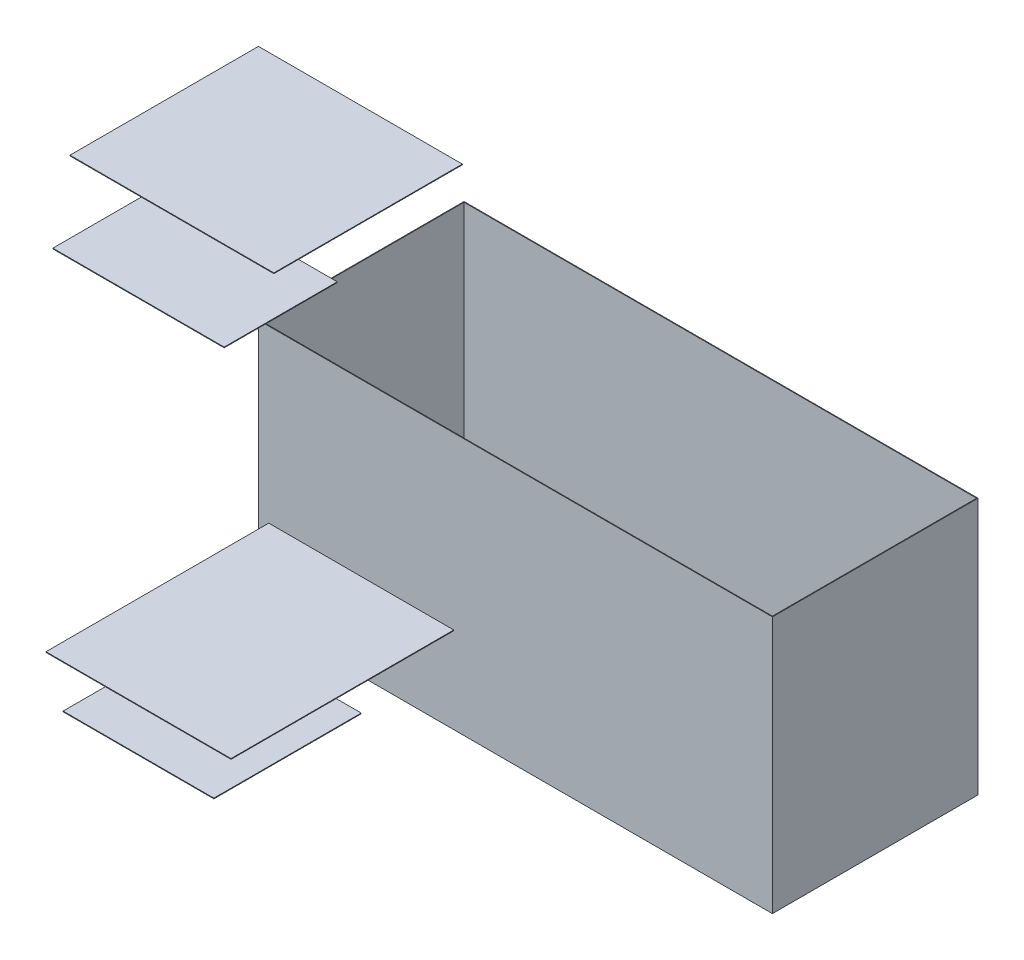
ISO-10303-21;
HEADER;
FILE_DESCRIPTION(('STEP AP214'),'2;1');
FILE_NAME('part.step','',(''),(''),'','','');
FILE_SCHEMA(('AUTOMOTIVE_DESIGN { 1 0 10303 214 1 1 1 1 }'));
ENDSEC;
DATA;
#1=APPLICATION_CONTEXT('core data for automotive mechanical design processes');
#2=APPLICATION_PROTOCOL_DEFINITION('international standard','automotive_design',2000,#1);
#3=PRODUCT_CONTEXT('',#1,'mechanical');
#4=PRODUCT('Part','Part','',(#3));
#5=PRODUCT_RELATED_PRODUCT_CATEGORY('part','',(#4));
#6=PRODUCT_DEFINITION_FORMATION('','',#4);
#7=PRODUCT_DEFINITION_CONTEXT('part definition',#1,'design');
#8=PRODUCT_DEFINITION('design','',#6,#7);
#9=PRODUCT_DEFINITION_SHAPE('','',#8);
#10=(LENGTH_UNIT() NAMED_UNIT(*) SI_UNIT(.MILLI.,.METRE.));
#11=(NAMED_UNIT(*) PLANE_ANGLE_UNIT() SI_UNIT($,.RADIAN.));
#12=(NAMED_UNIT(*) SI_UNIT($,.STERADIAN.) SOLID_ANGLE_UNIT());
#13=UNCERTAINTY_MEASURE_WITH_UNIT(LENGTH_MEASURE(1.E-05),#10,'distance_accuracy_value','');
#14=(GEOMETRIC_REPRESENTATION_CONTEXT(3) GLOBAL_UNCERTAINTY_ASSIGNED_CONTEXT((#13)) GLOBAL_UNIT_ASSIGNED_CONTEXT((#10,
#11,#12)) REPRESENTATION_CONTEXT('',''));
#15=CARTESIAN_POINT('',(0.,0.,0.));
#16=DIRECTION('',(0.,0.,1.));
#17=DIRECTION('',(1.,0.,0.));
#18=AXIS2_PLACEMENT_3D('',#15,#16,#17);
#19=CARTESIAN_POINT('',(30.,252.,-2.));
#20=DIRECTION('',(1.,0.,0.));
#21=DIRECTION('',(0.,0.,-1.));
#22=AXIS2_PLACEMENT_3D('',#19,#20,#21);
#23=PLANE('',#22);
#24=DIRECTION('',(0.,0.,1.));
#25=VECTOR('',#24,1.);
#26=CARTESIAN_POINT('',(30.,250.,-2.));
#27=LINE('',#26,#25);
#28=CARTESIAN_POINT('',(30.,250.,-2.));
#29=VERTEX_POINT('',#28);
#30=CARTESIAN_POINT('',(30.,250.,650.));
#31=VERTEX_POINT('',#30);
#32=EDGE_CURVE('E120',#29,#31,#27,.T.);
#33=ORIENTED_EDGE('',*,*,#32,.T.);
#34=DIRECTION('',(0.,-1.,0.));
#35=VECTOR('',#34,1.);
#36=CARTESIAN_POINT('',(30.,252.,650.));
#37=LINE('',#36,#35);
#38=CARTESIAN_POINT('',(30.,252.,650.));
#39=VERTEX_POINT('',#38);
#40=EDGE_CURVE('E12',#39,#31,#37,.T.);
#41=ORIENTED_EDGE('',*,*,#40,.F.);
#42=DIRECTION('',(0.,0.,1.));
#43=VECTOR('',#42,1.);
#44=CARTESIAN_POINT('',(30.,252.,-2.));
#45=LINE('',#44,#43);
#46=CARTESIAN_POINT('',(30.,252.,-2.));
#47=VERTEX_POINT('',#46);
#48=EDGE_CURVE('E104',#47,#39,#45,.T.);
#49=ORIENTED_EDGE('',*,*,#48,.F.);
#50=DIRECTION('',(0.,-1.,0.));
#51=VECTOR('',#50,1.);
#52=CARTESIAN_POINT('',(30.,252.,-2.));
#53=LINE('',#52,#51);
#54=EDGE_CURVE('E114',#47,#29,#53,.T.);
#55=ORIENTED_EDGE('',*,*,#54,.T.);
#56=EDGE_LOOP('',(#33,#41,#49,#55));
#57=FACE_BOUND('',#56,.T.);
#58=ADVANCED_FACE('F53',(#57),#23,.F.);
#59=CARTESIAN_POINT('',(30.,252.,650.));
#60=DIRECTION('',(0.,0.,-1.));
#61=DIRECTION('',(-1.,0.,0.));
#62=AXIS2_PLACEMENT_3D('',#59,#60,#61);
#63=PLANE('',#62);
#64=DIRECTION('',(1.,0.,0.));
#65=VECTOR('',#64,1.);
#66=CARTESIAN_POINT('',(30.,250.,650.));
#67=LINE('',#66,#65);
#68=CARTESIAN_POINT('',(570.,250.,650.));
#69=VERTEX_POINT('',#68);
#70=EDGE_CURVE('E108',#31,#69,#67,.T.);
#71=ORIENTED_EDGE('',*,*,#70,.T.);
#72=DIRECTION('',(0.,-1.,0.));
#73=VECTOR('',#72,1.);
#74=CARTESIAN_POINT('',(570.,252.,650.));
#75=LINE('',#74,#73);
#76=CARTESIAN_POINT('',(570.,252.,650.));
#77=VERTEX_POINT('',#76);
#78=EDGE_CURVE('E65',#77,#69,#75,.T.);
#79=ORIENTED_EDGE('',*,*,#78,.F.);
#80=DIRECTION('',(1.,0.,0.));
#81=VECTOR('',#80,1.);
#82=CARTESIAN_POINT('',(30.,252.,650.));
#83=LINE('',#82,#81);
#84=EDGE_CURVE('E99',#39,#77,#83,.T.);
#85=ORIENTED_EDGE('',*,*,#84,.F.);
#86=ORIENTED_EDGE('',*,*,#40,.T.);
#87=EDGE_LOOP('',(#71,#79,#85,#86));
#88=FACE_BOUND('',#87,.T.);
#89=ADVANCED_FACE('F107',(#88),#63,.F.);
#90=CARTESIAN_POINT('',(570.,252.,-2.));
#91=DIRECTION('',(-1.,0.,0.));
#92=DIRECTION('',(0.,0.,1.));
#93=AXIS2_PLACEMENT_3D('',#90,#91,#92);
#94=PLANE('',#93);
#95=DIRECTION('',(0.,0.,-1.));
#96=VECTOR('',#95,1.);
#97=CARTESIAN_POINT('',(570.,250.,-2.));
#98=LINE('',#97,#96);
#99=CARTESIAN_POINT('',(570.,250.,-2.));
#100=VERTEX_POINT('',#99);
#101=EDGE_CURVE('E87',#69,#100,#98,.T.);
#102=ORIENTED_EDGE('',*,*,#101,.T.);
#103=DIRECTION('',(0.,-1.,0.));
#104=VECTOR('',#103,1.);
#105=CARTESIAN_POINT('',(570.,252.,-2.));
#106=LINE('',#105,#104);
#107=CARTESIAN_POINT('',(570.,252.,-2.));
#108=VERTEX_POINT('',#107);
#109=EDGE_CURVE('E109',#108,#100,#106,.T.);
#110=ORIENTED_EDGE('',*,*,#109,.F.);
#111=DIRECTION('',(0.,0.,-1.));
#112=VECTOR('',#111,1.);
#113=CARTESIAN_POINT('',(570.,252.,-2.));
#114=LINE('',#113,#112);
#115=EDGE_CURVE('E103',#77,#108,#114,.T.);
#116=ORIENTED_EDGE('',*,*,#115,.F.);
#117=ORIENTED_EDGE('',*,*,#78,.T.);
#118=EDGE_LOOP('',(#102,#110,#116,#117));
#119=FACE_BOUND('',#118,.T.);
#120=ADVANCED_FACE('F112',(#119),#94,.F.);
#121=CARTESIAN_POINT('',(30.,252.,-2.));
#122=DIRECTION('',(0.,0.,1.));
#123=DIRECTION('',(1.,0.,0.));
#124=AXIS2_PLACEMENT_3D('',#121,#122,#123);
#125=PLANE('',#124);
#126=DIRECTION('',(-1.,0.,0.));
#127=VECTOR('',#126,1.);
#128=CARTESIAN_POINT('',(30.,250.,-2.));
#129=LINE('',#128,#127);
#130=EDGE_CURVE('E91',#100,#29,#129,.T.);
#131=ORIENTED_EDGE('',*,*,#130,.T.);
#132=ORIENTED_EDGE('',*,*,#54,.F.);
#133=DIRECTION('',(-1.,0.,0.));
#134=VECTOR('',#133,1.);
#135=CARTESIAN_POINT('',(30.,252.,-2.));
#136=LINE('',#135,#134);
#137=EDGE_CURVE('E69',#108,#47,#136,.T.);
#138=ORIENTED_EDGE('',*,*,#137,.F.);
#139=ORIENTED_EDGE('',*,*,#109,.T.);
#140=EDGE_LOOP('',(#131,#132,#138,#139));
#141=FACE_BOUND('',#140,.T.);
#142=ADVANCED_FACE('F122',(#141),#125,.F.);
#143=CARTESIAN_POINT('',(0.,252.,0.));
#144=DIRECTION('',(0.,1.,0.));
#145=DIRECTION('',(0.,0.,1.));
#146=AXIS2_PLACEMENT_3D('',#143,#144,#145);
#147=PLANE('',#146);
#148=ORIENTED_EDGE('',*,*,#48,.T.);
#149=ORIENTED_EDGE('',*,*,#84,.T.);
#150=ORIENTED_EDGE('',*,*,#115,.T.);
#151=ORIENTED_EDGE('',*,*,#137,.T.);
#152=EDGE_LOOP('',(#148,#149,#150,#151));
#153=FACE_BOUND('',#152,.T.);
#154=ADVANCED_FACE('F101',(#153),#147,.T.);
#155=CARTESIAN_POINT('',(0.,250.,0.));
#156=DIRECTION('',(0.,1.,0.));
#157=DIRECTION('',(0.,0.,1.));
#158=AXIS2_PLACEMENT_3D('',#155,#156,#157);
#159=PLANE('',#158);
#160=ORIENTED_EDGE('',*,*,#32,.F.);
#161=ORIENTED_EDGE('',*,*,#130,.F.);
#162=ORIENTED_EDGE('',*,*,#101,.F.);
#163=ORIENTED_EDGE('',*,*,#70,.F.);
#164=EDGE_LOOP('',(#160,#161,#162,#163));
#165=FACE_BOUND('',#164,.T.);
#166=ADVANCED_FACE('F130',(#165),#159,.F.);
#167=CLOSED_SHELL('',(#58,#89,#120,#142,#154,#166));
#168=MANIFOLD_SOLID_BREP('B2',#167);
#169=CARTESIAN_POINT('',(0.,1442.,0.));
#170=DIRECTION('',(1.,0.,0.));
#171=DIRECTION('',(0.,0.,-1.));
#172=AXIS2_PLACEMENT_3D('',#169,#170,#171);
#173=PLANE('',#172);
#174=DIRECTION('',(0.,0.,1.));
#175=VECTOR('',#174,1.);
#176=CARTESIAN_POINT('',(0.,1440.,0.));
#177=LINE('',#176,#175);
#178=CARTESIAN_POINT('',(0.,1440.,0.));
#179=VERTEX_POINT('',#178);
#180=CARTESIAN_POINT('',(0.,1440.,550.));
#181=VERTEX_POINT('',#180);
#182=EDGE_CURVE('E253',#179,#181,#177,.T.);
#183=ORIENTED_EDGE('',*,*,#182,.T.);
#184=DIRECTION('',(0.,-1.,0.));
#185=VECTOR('',#184,1.);
#186=CARTESIAN_POINT('',(0.,1442.,550.));
#187=LINE('',#186,#185);
#188=CARTESIAN_POINT('',(0.,1442.,550.));
#189=VERTEX_POINT('',#188);
#190=EDGE_CURVE('E55',#189,#181,#187,.T.);
#191=ORIENTED_EDGE('',*,*,#190,.F.);
#192=DIRECTION('',(0.,0.,1.));
#193=VECTOR('',#192,1.);
#194=CARTESIAN_POINT('',(0.,1442.,0.));
#195=LINE('',#194,#193);
#196=CARTESIAN_POINT('',(0.,1442.,0.));
#197=VERTEX_POINT('',#196);
#198=EDGE_CURVE('E239',#197,#189,#195,.T.);
#199=ORIENTED_EDGE('',*,*,#198,.F.);
#200=DIRECTION('',(0.,-1.,0.));
#201=VECTOR('',#200,1.);
#202=CARTESIAN_POINT('',(0.,1442.,0.));
#203=LINE('',#202,#201);
#204=EDGE_CURVE('E250',#197,#179,#203,.T.);
#205=ORIENTED_EDGE('',*,*,#204,.T.);
#206=EDGE_LOOP('',(#183,#191,#199,#205));
#207=FACE_BOUND('',#206,.T.);
#208=ADVANCED_FACE('F188',(#207),#173,.F.);
#209=CARTESIAN_POINT('',(0.,1442.,550.));
#210=DIRECTION('',(0.,0.,-1.));
#211=DIRECTION('',(-1.,0.,0.));
#212=AXIS2_PLACEMENT_3D('',#209,#210,#211);
#213=PLANE('',#212);
#214=DIRECTION('',(1.,0.,0.));
#215=VECTOR('',#214,1.);
#216=CARTESIAN_POINT('',(0.,1440.,550.));
#217=LINE('',#216,#215);
#218=CARTESIAN_POINT('',(595.,1440.,550.));
#219=VERTEX_POINT('',#218);
#220=EDGE_CURVE('E243',#181,#219,#217,.T.);
#221=ORIENTED_EDGE('',*,*,#220,.T.);
#222=DIRECTION('',(0.,-1.,0.));
#223=VECTOR('',#222,1.);
#224=CARTESIAN_POINT('',(595.,1442.,550.));
#225=LINE('',#224,#223);
#226=CARTESIAN_POINT('',(595.,1442.,550.));
#227=VERTEX_POINT('',#226);
#228=EDGE_CURVE('E198',#227,#219,#225,.T.);
#229=ORIENTED_EDGE('',*,*,#228,.F.);
#230=DIRECTION('',(1.,0.,0.));
#231=VECTOR('',#230,1.);
#232=CARTESIAN_POINT('',(0.,1442.,550.));
#233=LINE('',#232,#231);
#234=EDGE_CURVE('E232',#189,#227,#233,.T.);
#235=ORIENTED_EDGE('',*,*,#234,.F.);
#236=ORIENTED_EDGE('',*,*,#190,.T.);
#237=EDGE_LOOP('',(#221,#229,#235,#236));
#238=FACE_BOUND('',#237,.T.);
#239=ADVANCED_FACE('F245',(#238),#213,.F.);
#240=CARTESIAN_POINT('',(595.,1442.,0.));
#241=DIRECTION('',(-1.,0.,0.));
#242=DIRECTION('',(0.,0.,1.));
#243=AXIS2_PLACEMENT_3D('',#240,#241,#242);
#244=PLANE('',#243);
#245=DIRECTION('',(0.,0.,-1.));
#246=VECTOR('',#245,1.);
#247=CARTESIAN_POINT('',(595.,1440.,0.));
#248=LINE('',#247,#246);
#249=CARTESIAN_POINT('',(595.,1440.,0.));
#250=VERTEX_POINT('',#249);
#251=EDGE_CURVE('E222',#219,#250,#248,.T.);
#252=ORIENTED_EDGE('',*,*,#251,.T.);
#253=DIRECTION('',(0.,-1.,0.));
#254=VECTOR('',#253,1.);
#255=CARTESIAN_POINT('',(595.,1442.,0.));
#256=LINE('',#255,#254);
#257=CARTESIAN_POINT('',(595.,1442.,0.));
#258=VERTEX_POINT('',#257);
#259=EDGE_CURVE('E244',#258,#250,#256,.T.);
#260=ORIENTED_EDGE('',*,*,#259,.F.);
#261=DIRECTION('',(0.,0.,-1.));
#262=VECTOR('',#261,1.);
#263=CARTESIAN_POINT('',(595.,1442.,0.));
#264=LINE('',#263,#262);
#265=EDGE_CURVE('E240',#227,#258,#264,.T.);
#266=ORIENTED_EDGE('',*,*,#265,.F.);
#267=ORIENTED_EDGE('',*,*,#228,.T.);
#268=EDGE_LOOP('',(#252,#260,#266,#267));
#269=FACE_BOUND('',#268,.T.);
#270=ADVANCED_FACE('F241',(#269),#244,.F.);
#271=CARTESIAN_POINT('',(0.,1442.,0.));
#272=DIRECTION('',(0.,0.,1.));
#273=DIRECTION('',(1.,0.,0.));
#274=AXIS2_PLACEMENT_3D('',#271,#272,#273);
#275=PLANE('',#274);
#276=DIRECTION('',(-1.,0.,0.));
#277=VECTOR('',#276,1.);
#278=CARTESIAN_POINT('',(0.,1440.,0.));
#279=LINE('',#278,#277);
#280=EDGE_CURVE('E230',#250,#179,#279,.T.);
#281=ORIENTED_EDGE('',*,*,#280,.T.);
#282=ORIENTED_EDGE('',*,*,#204,.F.);
#283=DIRECTION('',(-1.,0.,0.));
#284=VECTOR('',#283,1.);
#285=CARTESIAN_POINT('',(0.,1442.,0.));
#286=LINE('',#285,#284);
#287=EDGE_CURVE('E204',#258,#197,#286,.T.);
#288=ORIENTED_EDGE('',*,*,#287,.F.);
#289=ORIENTED_EDGE('',*,*,#259,.T.);
#290=EDGE_LOOP('',(#281,#282,#288,#289));
#291=FACE_BOUND('',#290,.T.);
#292=ADVANCED_FACE('F256',(#291),#275,.F.);
#293=CARTESIAN_POINT('',(0.,1442.,0.));
#294=DIRECTION('',(0.,1.,0.));
#295=DIRECTION('',(0.,0.,1.));
#296=AXIS2_PLACEMENT_3D('',#293,#294,#295);
#297=PLANE('',#296);
#298=ORIENTED_EDGE('',*,*,#198,.T.);
#299=ORIENTED_EDGE('',*,*,#234,.T.);
#300=ORIENTED_EDGE('',*,*,#265,.T.);
#301=ORIENTED_EDGE('',*,*,#287,.T.);
#302=EDGE_LOOP('',(#298,#299,#300,#301));
#303=FACE_BOUND('',#302,.T.);
#304=ADVANCED_FACE('F234',(#303),#297,.T.);
#305=CARTESIAN_POINT('',(0.,1440.,0.));
#306=DIRECTION('',(0.,1.,0.));
#307=DIRECTION('',(0.,0.,1.));
#308=AXIS2_PLACEMENT_3D('',#305,#306,#307);
#309=PLANE('',#308);
#310=ORIENTED_EDGE('',*,*,#182,.F.);
#311=ORIENTED_EDGE('',*,*,#280,.F.);
#312=ORIENTED_EDGE('',*,*,#251,.F.);
#313=ORIENTED_EDGE('',*,*,#220,.F.);
#314=EDGE_LOOP('',(#310,#311,#312,#313));
#315=FACE_BOUND('',#314,.T.);
#316=ADVANCED_FACE('F261',(#315),#309,.F.);
#317=CLOSED_SHELL('',(#208,#239,#270,#292,#304,#316));
#318=MANIFOLD_SOLID_BREP('B6',#317);
#319=CARTESIAN_POINT('',(50.,1282.,320.));
#320=DIRECTION('',(1.,0.,0.));
#321=DIRECTION('',(0.,0.,-1.));
#322=AXIS2_PLACEMENT_3D('',#319,#320,#321);
#323=PLANE('',#322);
#324=DIRECTION('',(0.,0.,1.));
#325=VECTOR('',#324,1.);
#326=CARTESIAN_POINT('',(50.,1280.,320.));
#327=LINE('',#326,#325);
#328=CARTESIAN_POINT('',(50.,1280.,320.));
#329=VERTEX_POINT('',#328);
#330=CARTESIAN_POINT('',(50.,1280.,650.));
#331=VERTEX_POINT('',#330);
#332=EDGE_CURVE('E384',#329,#331,#327,.T.);
#333=ORIENTED_EDGE('',*,*,#332,.T.);
#334=DIRECTION('',(0.,-1.,0.));
#335=VECTOR('',#334,1.);
#336=CARTESIAN_POINT('',(50.,1282.,650.));
#337=LINE('',#336,#335);
#338=CARTESIAN_POINT('',(50.,1282.,650.));
#339=VERTEX_POINT('',#338);
#340=EDGE_CURVE('E187',#339,#331,#337,.T.);
#341=ORIENTED_EDGE('',*,*,#340,.F.);
#342=DIRECTION('',(0.,0.,1.));
#343=VECTOR('',#342,1.);
#344=CARTESIAN_POINT('',(50.,1282.,320.));
#345=LINE('',#344,#343);
#346=CARTESIAN_POINT('',(50.,1282.,320.));
#347=VERTEX_POINT('',#346);
#348=EDGE_CURVE('E373',#347,#339,#345,.T.);
#349=ORIENTED_EDGE('',*,*,#348,.F.);
#350=DIRECTION('',(0.,-1.,0.));
#351=VECTOR('',#350,1.);
#352=CARTESIAN_POINT('',(50.,1282.,320.));
#353=LINE('',#352,#351);
#354=EDGE_CURVE('E381',#347,#329,#353,.T.);
#355=ORIENTED_EDGE('',*,*,#354,.T.);
#356=EDGE_LOOP('',(#333,#341,#349,#355));
#357=FACE_BOUND('',#356,.T.);
#358=ADVANCED_FACE('F325',(#357),#323,.F.);
#359=CARTESIAN_POINT('',(50.,1282.,650.));
#360=DIRECTION('',(0.,0.,-1.));
#361=DIRECTION('',(-1.,0.,0.));
#362=AXIS2_PLACEMENT_3D('',#359,#360,#361);
#363=PLANE('',#362);
#364=DIRECTION('',(1.,0.,0.));
#365=VECTOR('',#364,1.);
#366=CARTESIAN_POINT('',(50.,1280.,650.));
#367=LINE('',#366,#365);
#368=CARTESIAN_POINT('',(550.,1280.,650.));
#369=VERTEX_POINT('',#368);
#370=EDGE_CURVE('E380',#331,#369,#367,.T.);
#371=ORIENTED_EDGE('',*,*,#370,.T.);
#372=DIRECTION('',(0.,-1.,0.));
#373=VECTOR('',#372,1.);
#374=CARTESIAN_POINT('',(550.,1282.,650.));
#375=LINE('',#374,#373);
#376=CARTESIAN_POINT('',(550.,1282.,650.));
#377=VERTEX_POINT('',#376);
#378=EDGE_CURVE('E329',#377,#369,#375,.T.);
#379=ORIENTED_EDGE('',*,*,#378,.F.);
#380=DIRECTION('',(1.,0.,0.));
#381=VECTOR('',#380,1.);
#382=CARTESIAN_POINT('',(50.,1282.,650.));
#383=LINE('',#382,#381);
#384=EDGE_CURVE('E366',#339,#377,#383,.T.);
#385=ORIENTED_EDGE('',*,*,#384,.F.);
#386=ORIENTED_EDGE('',*,*,#340,.T.);
#387=EDGE_LOOP('',(#371,#379,#385,#386));
#388=FACE_BOUND('',#387,.T.);
#389=ADVANCED_FACE('F376',(#388),#363,.F.);
#390=CARTESIAN_POINT('',(550.,1282.,320.));
#391=DIRECTION('',(-1.,0.,0.));
#392=DIRECTION('',(0.,0.,1.));
#393=AXIS2_PLACEMENT_3D('',#390,#391,#392);
#394=PLANE('',#393);
#395=DIRECTION('',(0.,0.,-1.));
#396=VECTOR('',#395,1.);
#397=CARTESIAN_POINT('',(550.,1280.,320.));
#398=LINE('',#397,#396);
#399=CARTESIAN_POINT('',(550.,1280.,320.));
#400=VERTEX_POINT('',#399);
#401=EDGE_CURVE('E351',#369,#400,#398,.T.);
#402=ORIENTED_EDGE('',*,*,#401,.T.);
#403=DIRECTION('',(0.,-1.,0.));
#404=VECTOR('',#403,1.);
#405=CARTESIAN_POINT('',(550.,1282.,320.));
#406=LINE('',#405,#404);
#407=CARTESIAN_POINT('',(550.,1282.,320.));
#408=VERTEX_POINT('',#407);
#409=EDGE_CURVE('E378',#408,#400,#406,.T.);
#410=ORIENTED_EDGE('',*,*,#409,.F.);
#411=DIRECTION('',(0.,0.,-1.));
#412=VECTOR('',#411,1.);
#413=CARTESIAN_POINT('',(550.,1282.,320.));
#414=LINE('',#413,#412);
#415=EDGE_CURVE('E371',#377,#408,#414,.T.);
#416=ORIENTED_EDGE('',*,*,#415,.F.);
#417=ORIENTED_EDGE('',*,*,#378,.T.);
#418=EDGE_LOOP('',(#402,#410,#416,#417));
#419=FACE_BOUND('',#418,.T.);
#420=ADVANCED_FACE('F377',(#419),#394,.F.);
#421=CARTESIAN_POINT('',(50.,1282.,320.));
#422=DIRECTION('',(0.,0.,1.));
#423=DIRECTION('',(1.,0.,0.));
#424=AXIS2_PLACEMENT_3D('',#421,#422,#423);
#425=PLANE('',#424);
#426=DIRECTION('',(-1.,0.,0.));
#427=VECTOR('',#426,1.);
#428=CARTESIAN_POINT('',(50.,1280.,320.));
#429=LINE('',#428,#427);
#430=EDGE_CURVE('E363',#400,#329,#429,.T.);
#431=ORIENTED_EDGE('',*,*,#430,.T.);
#432=ORIENTED_EDGE('',*,*,#354,.F.);
#433=DIRECTION('',(-1.,0.,0.));
#434=VECTOR('',#433,1.);
#435=CARTESIAN_POINT('',(50.,1282.,320.));
#436=LINE('',#435,#434);
#437=EDGE_CURVE('E338',#408,#347,#436,.T.);
#438=ORIENTED_EDGE('',*,*,#437,.F.);
#439=ORIENTED_EDGE('',*,*,#409,.T.);
#440=EDGE_LOOP('',(#431,#432,#438,#439));
#441=FACE_BOUND('',#440,.T.);
#442=ADVANCED_FACE('F395',(#441),#425,.F.);
#443=CARTESIAN_POINT('',(0.,1282.,0.));
#444=DIRECTION('',(0.,1.,0.));
#445=DIRECTION('',(0.,0.,1.));
#446=AXIS2_PLACEMENT_3D('',#443,#444,#445);
#447=PLANE('',#446);
#448=ORIENTED_EDGE('',*,*,#348,.T.);
#449=ORIENTED_EDGE('',*,*,#384,.T.);
#450=ORIENTED_EDGE('',*,*,#415,.T.);
#451=ORIENTED_EDGE('',*,*,#437,.T.);
#452=EDGE_LOOP('',(#448,#449,#450,#451));
#453=FACE_BOUND('',#452,.T.);
#454=ADVANCED_FACE('F369',(#453),#447,.T.);
#455=CARTESIAN_POINT('',(0.,1280.,0.));
#456=DIRECTION('',(0.,1.,0.));
#457=DIRECTION('',(0.,0.,1.));
#458=AXIS2_PLACEMENT_3D('',#455,#456,#457);
#459=PLANE('',#458);
#460=ORIENTED_EDGE('',*,*,#332,.F.);
#461=ORIENTED_EDGE('',*,*,#430,.F.);
#462=ORIENTED_EDGE('',*,*,#401,.F.);
#463=ORIENTED_EDGE('',*,*,#370,.F.);
#464=EDGE_LOOP('',(#460,#461,#462,#463));
#465=FACE_BOUND('',#464,.T.);
#466=ADVANCED_FACE('F391',(#465),#459,.F.);
#467=CLOSED_SHELL('',(#358,#389,#420,#442,#454,#466));
#468=MANIFOLD_SOLID_BREP('B46',#467);
#469=CARTESIAN_POINT('',(80.,127.,220.));
#470=DIRECTION('',(1.,0.,0.));
#471=DIRECTION('',(0.,0.,-1.));
#472=AXIS2_PLACEMENT_3D('',#469,#470,#471);
#473=PLANE('',#472);
#474=DIRECTION('',(0.,0.,1.));
#475=VECTOR('',#474,1.);
#476=CARTESIAN_POINT('',(80.,125.,220.));
#477=LINE('',#476,#475);
#478=CARTESIAN_POINT('',(80.,125.,220.));
#479=VERTEX_POINT('',#478);
#480=CARTESIAN_POINT('',(80.,125.,650.));
#481=VERTEX_POINT('',#480);
#482=EDGE_CURVE('E518',#479,#481,#477,.T.);
#483=ORIENTED_EDGE('',*,*,#482,.T.);
#484=DIRECTION('',(0.,-1.,0.));
#485=VECTOR('',#484,1.);
#486=CARTESIAN_POINT('',(80.,127.,650.));
#487=LINE('',#486,#485);
#488=CARTESIAN_POINT('',(80.,127.,650.));
#489=VERTEX_POINT('',#488);
#490=EDGE_CURVE('E319',#489,#481,#487,.T.);
#491=ORIENTED_EDGE('',*,*,#490,.F.);
#492=DIRECTION('',(0.,0.,1.));
#493=VECTOR('',#492,1.);
#494=CARTESIAN_POINT('',(80.,127.,220.));
#495=LINE('',#494,#493);
#496=CARTESIAN_POINT('',(80.,127.,220.));
#497=VERTEX_POINT('',#496);
#498=EDGE_CURVE('E506',#497,#489,#495,.T.);
#499=ORIENTED_EDGE('',*,*,#498,.F.);
#500=DIRECTION('',(0.,-1.,0.));
#501=VECTOR('',#500,1.);
#502=CARTESIAN_POINT('',(80.,127.,220.));
#503=LINE('',#502,#501);
#504=EDGE_CURVE('E514',#497,#479,#503,.T.);
#505=ORIENTED_EDGE('',*,*,#504,.T.);
#506=EDGE_LOOP('',(#483,#491,#499,#505));
#507=FACE_BOUND('',#506,.T.);
#508=ADVANCED_FACE('F454',(#507),#473,.F.);
#509=CARTESIAN_POINT('',(80.,127.,650.));
#510=DIRECTION('',(0.,0.,-1.));
#511=DIRECTION('',(-1.,0.,0.));
#512=AXIS2_PLACEMENT_3D('',#509,#510,#511);
#513=PLANE('',#512);
#514=DIRECTION('',(1.,0.,0.));
#515=VECTOR('',#514,1.);
#516=CARTESIAN_POINT('',(80.,125.,650.));
#517=LINE('',#516,#515);
#518=CARTESIAN_POINT('',(520.,125.,650.));
#519=VERTEX_POINT('',#518);
#520=EDGE_CURVE('E509',#481,#519,#517,.T.);
#521=ORIENTED_EDGE('',*,*,#520,.T.);
#522=DIRECTION('',(0.,-1.,0.));
#523=VECTOR('',#522,1.);
#524=CARTESIAN_POINT('',(520.,127.,650.));
#525=LINE('',#524,#523);
#526=CARTESIAN_POINT('',(520.,127.,650.));
#527=VERTEX_POINT('',#526);
#528=EDGE_CURVE('E463',#527,#519,#525,.T.);
#529=ORIENTED_EDGE('',*,*,#528,.F.);
#530=DIRECTION('',(1.,0.,0.));
#531=VECTOR('',#530,1.);
#532=CARTESIAN_POINT('',(80.,127.,650.));
#533=LINE('',#532,#531);
#534=EDGE_CURVE('E502',#489,#527,#533,.T.);
#535=ORIENTED_EDGE('',*,*,#534,.F.);
#536=ORIENTED_EDGE('',*,*,#490,.T.);
#537=EDGE_LOOP('',(#521,#529,#535,#536));
#538=FACE_BOUND('',#537,.T.);
#539=ADVANCED_FACE('F507',(#538),#513,.F.);
#540=CARTESIAN_POINT('',(520.,127.,220.));
#541=DIRECTION('',(-1.,0.,0.));
#542=DIRECTION('',(0.,0.,1.));
#543=AXIS2_PLACEMENT_3D('',#540,#541,#542);
#544=PLANE('',#543);
#545=DIRECTION('',(0.,0.,-1.));
#546=VECTOR('',#545,1.);
#547=CARTESIAN_POINT('',(520.,125.,220.));
#548=LINE('',#547,#546);
#549=CARTESIAN_POINT('',(520.,125.,220.));
#550=VERTEX_POINT('',#549);
#551=EDGE_CURVE('E488',#519,#550,#548,.T.);
#552=ORIENTED_EDGE('',*,*,#551,.T.);
#553=DIRECTION('',(0.,-1.,0.));
#554=VECTOR('',#553,1.);
#555=CARTESIAN_POINT('',(520.,127.,220.));
#556=LINE('',#555,#554);
#557=CARTESIAN_POINT('',(520.,127.,220.));
#558=VERTEX_POINT('',#557);
#559=EDGE_CURVE('E512',#558,#550,#556,.T.);
#560=ORIENTED_EDGE('',*,*,#559,.F.);
#561=DIRECTION('',(0.,0.,-1.));
#562=VECTOR('',#561,1.);
#563=CARTESIAN_POINT('',(520.,127.,220.));
#564=LINE('',#563,#562);
#565=EDGE_CURVE('E504',#527,#558,#564,.T.);
#566=ORIENTED_EDGE('',*,*,#565,.F.);
#567=ORIENTED_EDGE('',*,*,#528,.T.);
#568=EDGE_LOOP('',(#552,#560,#566,#567));
#569=FACE_BOUND('',#568,.T.);
#570=ADVANCED_FACE('F515',(#569),#544,.F.);
#571=CARTESIAN_POINT('',(80.,127.,220.));
#572=DIRECTION('',(0.,0.,1.));
#573=DIRECTION('',(1.,0.,0.));
#574=AXIS2_PLACEMENT_3D('',#571,#572,#573);
#575=PLANE('',#574);
#576=DIRECTION('',(-1.,0.,0.));
#577=VECTOR('',#576,1.);
#578=CARTESIAN_POINT('',(80.,125.,220.));
#579=LINE('',#578,#577);
#580=EDGE_CURVE('E493',#550,#479,#579,.T.);
#581=ORIENTED_EDGE('',*,*,#580,.T.);
#582=ORIENTED_EDGE('',*,*,#504,.F.);
#583=DIRECTION('',(-1.,0.,0.));
#584=VECTOR('',#583,1.);
#585=CARTESIAN_POINT('',(80.,127.,220.));
#586=LINE('',#585,#584);
#587=EDGE_CURVE('E473',#558,#497,#586,.T.);
#588=ORIENTED_EDGE('',*,*,#587,.F.);
#589=ORIENTED_EDGE('',*,*,#559,.T.);
#590=EDGE_LOOP('',(#581,#582,#588,#589));
#591=FACE_BOUND('',#590,.T.);
#592=ADVANCED_FACE('F524',(#591),#575,.F.);
#593=CARTESIAN_POINT('',(0.,127.,0.));
#594=DIRECTION('',(0.,1.,0.));
#595=DIRECTION('',(0.,0.,1.));
#596=AXIS2_PLACEMENT_3D('',#593,#594,#595);
#597=PLANE('',#596);
#598=ORIENTED_EDGE('',*,*,#498,.T.);
#599=ORIENTED_EDGE('',*,*,#534,.T.);
#600=ORIENTED_EDGE('',*,*,#565,.T.);
#601=ORIENTED_EDGE('',*,*,#587,.T.);
#602=EDGE_LOOP('',(#598,#599,#600,#601));
#603=FACE_BOUND('',#602,.T.);
#604=ADVANCED_FACE('F505',(#603),#597,.T.);
#605=CARTESIAN_POINT('',(0.,125.,0.));
#606=DIRECTION('',(0.,1.,0.));
#607=DIRECTION('',(0.,0.,1.));
#608=AXIS2_PLACEMENT_3D('',#605,#606,#607);
#609=PLANE('',#608);
#610=ORIENTED_EDGE('',*,*,#482,.F.);
#611=ORIENTED_EDGE('',*,*,#580,.F.);
#612=ORIENTED_EDGE('',*,*,#551,.F.);
#613=ORIENTED_EDGE('',*,*,#520,.F.);
#614=EDGE_LOOP('',(#610,#611,#612,#613));
#615=FACE_BOUND('',#614,.T.);
#616=ADVANCED_FACE('F526',(#615),#609,.F.);
#617=CLOSED_SHELL('',(#508,#539,#570,#592,#604,#616));
#618=MANIFOLD_SOLID_BREP('B179',#617);
#619=CARTESIAN_POINT('',(0.,750.,0.));
#620=DIRECTION('',(0.,-1.,0.));
#621=DIRECTION('',(0.,0.,-1.));
#622=AXIS2_PLACEMENT_3D('',#619,#620,#621);
#623=PLANE('',#622);
#624=DIRECTION('',(0.,0.,1.));
#625=VECTOR('',#624,1.);
#626=CARTESIAN_POINT('',(0.,750.,0.));
#627=LINE('',#626,#625);
#628=CARTESIAN_POINT('',(0.,750.,-600.));
#629=VERTEX_POINT('',#628);
#630=CARTESIAN_POINT('',(0.,750.,0.));
#631=VERTEX_POINT('',#630);
#632=EDGE_CURVE('E690',#629,#631,#627,.T.);
#633=ORIENTED_EDGE('',*,*,#632,.T.);
#634=DIRECTION('',(1.,0.,0.));
#635=VECTOR('',#634,1.);
#636=CARTESIAN_POINT('',(0.,750.,0.));
#637=LINE('',#636,#635);
#638=CARTESIAN_POINT('',(1500.,750.,0.));
#639=VERTEX_POINT('',#638);
#640=EDGE_CURVE('E631',#631,#639,#637,.T.);
#641=ORIENTED_EDGE('',*,*,#640,.T.);
#642=DIRECTION('',(0.,0.,-1.));
#643=VECTOR('',#642,1.);
#644=CARTESIAN_POINT('',(1500.,750.,0.));
#645=LINE('',#644,#643);
#646=CARTESIAN_POINT('',(1500.,750.,-600.));
#647=VERTEX_POINT('',#646);
#648=EDGE_CURVE('E689',#639,#647,#645,.T.);
#649=ORIENTED_EDGE('',*,*,#648,.T.);
#650=DIRECTION('',(-1.,0.,0.));
#651=VECTOR('',#650,1.);
#652=CARTESIAN_POINT('',(0.,750.,-600.));
#653=LINE('',#652,#651);
#654=EDGE_CURVE('E602',#647,#629,#653,.T.);
#655=ORIENTED_EDGE('',*,*,#654,.T.);
#656=EDGE_LOOP('',(#633,#641,#649,#655));
#657=FACE_BOUND('',#656,.T.);
#658=DIRECTION('',(0.,0.,1.));
#659=VECTOR('',#658,1.);
#660=CARTESIAN_POINT('',(2.,750.,0.));
#661=LINE('',#660,#659);
#662=CARTESIAN_POINT('',(2.,750.,-598.));
#663=VERTEX_POINT('',#662);
#664=CARTESIAN_POINT('',(2.,750.,-2.));
#665=VERTEX_POINT('',#664);
#666=EDGE_CURVE('E677',#663,#665,#661,.T.);
#667=ORIENTED_EDGE('',*,*,#666,.F.);
#668=DIRECTION('',(-1.,0.,0.));
#669=VECTOR('',#668,1.);
#670=CARTESIAN_POINT('',(0.,750.,-598.));
#671=LINE('',#670,#669);
#672=CARTESIAN_POINT('',(1498.,750.,-598.));
#673=VERTEX_POINT('',#672);
#674=EDGE_CURVE('E681',#673,#663,#671,.T.);
#675=ORIENTED_EDGE('',*,*,#674,.F.);
#676=DIRECTION('',(0.,0.,-1.));
#677=VECTOR('',#676,1.);
#678=CARTESIAN_POINT('',(1498.,750.,0.));
#679=LINE('',#678,#677);
#680=CARTESIAN_POINT('',(1498.,750.,-2.));
#681=VERTEX_POINT('',#680);
#682=EDGE_CURVE('E683',#681,#673,#679,.T.);
#683=ORIENTED_EDGE('',*,*,#682,.F.);
#684=DIRECTION('',(1.,0.,0.));
#685=VECTOR('',#684,1.);
#686=CARTESIAN_POINT('',(0.,750.,-2.));
#687=LINE('',#686,#685);
#688=EDGE_CURVE('E668',#665,#681,#687,.T.);
#689=ORIENTED_EDGE('',*,*,#688,.F.);
#690=EDGE_LOOP('',(#667,#675,#683,#689));
#691=FACE_BOUND('',#690,.T.);
#692=ADVANCED_FACE('F577',(#657,#691),#623,.F.);
#693=CARTESIAN_POINT('',(0.,750.,0.));
#694=DIRECTION('',(1.,0.,0.));
#695=DIRECTION('',(0.,0.,-1.));
#696=AXIS2_PLACEMENT_3D('',#693,#694,#695);
#697=PLANE('',#696);
#698=DIRECTION('',(0.,0.,1.));
#699=VECTOR('',#698,1.);
#700=CARTESIAN_POINT('',(0.,0.,0.));
#701=LINE('',#700,#699);
#702=CARTESIAN_POINT('',(0.,0.,-600.));
#703=VERTEX_POINT('',#702);
#704=CARTESIAN_POINT('',(0.,0.,0.));
#705=VERTEX_POINT('',#704);
#706=EDGE_CURVE('E695',#703,#705,#701,.T.);
#707=ORIENTED_EDGE('',*,*,#706,.T.);
#708=DIRECTION('',(0.,-1.,0.));
#709=VECTOR('',#708,1.);
#710=CARTESIAN_POINT('',(0.,750.,0.));
#711=LINE('',#710,#709);
#712=EDGE_CURVE('E453',#631,#705,#711,.T.);
#713=ORIENTED_EDGE('',*,*,#712,.F.);
#714=ORIENTED_EDGE('',*,*,#632,.F.);
#715=DIRECTION('',(0.,-1.,0.));
#716=VECTOR('',#715,1.);
#717=CARTESIAN_POINT('',(0.,750.,-600.));
#718=LINE('',#717,#716);
#719=EDGE_CURVE('E691',#629,#703,#718,.T.);
#720=ORIENTED_EDGE('',*,*,#719,.T.);
#721=EDGE_LOOP('',(#707,#713,#714,#720));
#722=FACE_BOUND('',#721,.T.);
#723=ADVANCED_FACE('F583',(#722),#697,.F.);
#724=CARTESIAN_POINT('',(0.,750.,0.));
#725=DIRECTION('',(0.,0.,-1.));
#726=DIRECTION('',(-1.,0.,0.));
#727=AXIS2_PLACEMENT_3D('',#724,#725,#726);
#728=PLANE('',#727);
#729=DIRECTION('',(1.,0.,0.));
#730=VECTOR('',#729,1.);
#731=CARTESIAN_POINT('',(0.,0.,0.));
#732=LINE('',#731,#730);
#733=CARTESIAN_POINT('',(1500.,0.,0.));
#734=VERTEX_POINT('',#733);
#735=EDGE_CURVE('E700',#705,#734,#732,.T.);
#736=ORIENTED_EDGE('',*,*,#735,.T.);
#737=DIRECTION('',(0.,-1.,0.));
#738=VECTOR('',#737,1.);
#739=CARTESIAN_POINT('',(1500.,750.,0.));
#740=LINE('',#739,#738);
#741=EDGE_CURVE('E590',#639,#734,#740,.T.);
#742=ORIENTED_EDGE('',*,*,#741,.F.);
#743=ORIENTED_EDGE('',*,*,#640,.F.);
#744=ORIENTED_EDGE('',*,*,#712,.T.);
#745=EDGE_LOOP('',(#736,#742,#743,#744));
#746=FACE_BOUND('',#745,.T.);
#747=ADVANCED_FACE('F721',(#746),#728,.F.);
#748=CARTESIAN_POINT('',(1500.,750.,0.));
#749=DIRECTION('',(-1.,0.,0.));
#750=DIRECTION('',(0.,0.,1.));
#751=AXIS2_PLACEMENT_3D('',#748,#749,#750);
#752=PLANE('',#751);
#753=DIRECTION('',(0.,0.,-1.));
#754=VECTOR('',#753,1.);
#755=CARTESIAN_POINT('',(1500.,0.,0.));
#756=LINE('',#755,#754);
#757=CARTESIAN_POINT('',(1500.,0.,-600.));
#758=VERTEX_POINT('',#757);
#759=EDGE_CURVE('E699',#734,#758,#756,.T.);
#760=ORIENTED_EDGE('',*,*,#759,.T.);
#761=DIRECTION('',(0.,-1.,0.));
#762=VECTOR('',#761,1.);
#763=CARTESIAN_POINT('',(1500.,750.,-600.));
#764=LINE('',#763,#762);
#765=EDGE_CURVE('E703',#647,#758,#764,.T.);
#766=ORIENTED_EDGE('',*,*,#765,.F.);
#767=ORIENTED_EDGE('',*,*,#648,.F.);
#768=ORIENTED_EDGE('',*,*,#741,.T.);
#769=EDGE_LOOP('',(#760,#766,#767,#768));
#770=FACE_BOUND('',#769,.T.);
#771=ADVANCED_FACE('F708',(#770),#752,.F.);
#772=CARTESIAN_POINT('',(0.,750.,-600.));
#773=DIRECTION('',(0.,0.,1.));
#774=DIRECTION('',(1.,0.,0.));
#775=AXIS2_PLACEMENT_3D('',#772,#773,#774);
#776=PLANE('',#775);
#777=DIRECTION('',(-1.,0.,0.));
#778=VECTOR('',#777,1.);
#779=CARTESIAN_POINT('',(0.,0.,-600.));
#780=LINE('',#779,#778);
#781=EDGE_CURVE('E624',#758,#703,#780,.T.);
#782=ORIENTED_EDGE('',*,*,#781,.T.);
#783=ORIENTED_EDGE('',*,*,#719,.F.);
#784=ORIENTED_EDGE('',*,*,#654,.F.);
#785=ORIENTED_EDGE('',*,*,#765,.T.);
#786=EDGE_LOOP('',(#782,#783,#784,#785));
#787=FACE_BOUND('',#786,.T.);
#788=ADVANCED_FACE('F717',(#787),#776,.F.);
#789=CARTESIAN_POINT('',(0.,0.,0.));
#790=DIRECTION('',(0.,-1.,0.));
#791=DIRECTION('',(0.,0.,-1.));
#792=AXIS2_PLACEMENT_3D('',#789,#790,#791);
#793=PLANE('',#792);
#794=ORIENTED_EDGE('',*,*,#706,.F.);
#795=ORIENTED_EDGE('',*,*,#781,.F.);
#796=ORIENTED_EDGE('',*,*,#759,.F.);
#797=ORIENTED_EDGE('',*,*,#735,.F.);
#798=EDGE_LOOP('',(#794,#795,#796,#797));
#799=FACE_BOUND('',#798,.T.);
#800=ADVANCED_FACE('F715',(#799),#793,.T.);
#801=CARTESIAN_POINT('',(2.,750.,0.));
#802=DIRECTION('',(1.,0.,0.));
#803=DIRECTION('',(0.,0.,-1.));
#804=AXIS2_PLACEMENT_3D('',#801,#802,#803);
#805=PLANE('',#804);
#806=DIRECTION('',(0.,0.,1.));
#807=VECTOR('',#806,1.);
#808=CARTESIAN_POINT('',(2.,2.,0.));
#809=LINE('',#808,#807);
#810=CARTESIAN_POINT('',(2.,2.,-598.));
#811=VERTEX_POINT('',#810);
#812=CARTESIAN_POINT('',(2.,2.,-2.));
#813=VERTEX_POINT('',#812);
#814=EDGE_CURVE('E658',#811,#813,#809,.T.);
#815=ORIENTED_EDGE('',*,*,#814,.F.);
#816=DIRECTION('',(0.,-1.,0.));
#817=VECTOR('',#816,1.);
#818=CARTESIAN_POINT('',(2.,750.,-598.));
#819=LINE('',#818,#817);
#820=EDGE_CURVE('E679',#663,#811,#819,.T.);
#821=ORIENTED_EDGE('',*,*,#820,.F.);
#822=ORIENTED_EDGE('',*,*,#666,.T.);
#823=DIRECTION('',(0.,-1.,0.));
#824=VECTOR('',#823,1.);
#825=CARTESIAN_POINT('',(2.,750.,-2.));
#826=LINE('',#825,#824);
#827=EDGE_CURVE('E671',#665,#813,#826,.T.);
#828=ORIENTED_EDGE('',*,*,#827,.T.);
#829=EDGE_LOOP('',(#815,#821,#822,#828));
#830=FACE_BOUND('',#829,.T.);
#831=ADVANCED_FACE('F723',(#830),#805,.T.);
#832=CARTESIAN_POINT('',(0.,750.,-2.));
#833=DIRECTION('',(0.,0.,-1.));
#834=DIRECTION('',(-1.,0.,0.));
#835=AXIS2_PLACEMENT_3D('',#832,#833,#834);
#836=PLANE('',#835);
#837=DIRECTION('',(1.,0.,0.));
#838=VECTOR('',#837,1.);
#839=CARTESIAN_POINT('',(0.,2.,-2.));
#840=LINE('',#839,#838);
#841=CARTESIAN_POINT('',(1498.,2.,-2.));
#842=VERTEX_POINT('',#841);
#843=EDGE_CURVE('E653',#813,#842,#840,.T.);
#844=ORIENTED_EDGE('',*,*,#843,.F.);
#845=ORIENTED_EDGE('',*,*,#827,.F.);
#846=ORIENTED_EDGE('',*,*,#688,.T.);
#847=DIRECTION('',(0.,-1.,0.));
#848=VECTOR('',#847,1.);
#849=CARTESIAN_POINT('',(1498.,750.,-2.));
#850=LINE('',#849,#848);
#851=EDGE_CURVE('E663',#681,#842,#850,.T.);
#852=ORIENTED_EDGE('',*,*,#851,.T.);
#853=EDGE_LOOP('',(#844,#845,#846,#852));
#854=FACE_BOUND('',#853,.T.);
#855=ADVANCED_FACE('F667',(#854),#836,.T.);
#856=CARTESIAN_POINT('',(1498.,750.,0.));
#857=DIRECTION('',(-1.,0.,0.));
#858=DIRECTION('',(0.,0.,1.));
#859=AXIS2_PLACEMENT_3D('',#856,#857,#858);
#860=PLANE('',#859);
#861=DIRECTION('',(0.,0.,-1.));
#862=VECTOR('',#861,1.);
#863=CARTESIAN_POINT('',(1498.,2.,0.));
#864=LINE('',#863,#862);
#865=CARTESIAN_POINT('',(1498.,2.,-598.));
#866=VERTEX_POINT('',#865);
#867=EDGE_CURVE('E660',#842,#866,#864,.T.);
#868=ORIENTED_EDGE('',*,*,#867,.F.);
#869=ORIENTED_EDGE('',*,*,#851,.F.);
#870=ORIENTED_EDGE('',*,*,#682,.T.);
#871=DIRECTION('',(0.,-1.,0.));
#872=VECTOR('',#871,1.);
#873=CARTESIAN_POINT('',(1498.,750.,-598.));
#874=LINE('',#873,#872);
#875=EDGE_CURVE('E592',#673,#866,#874,.T.);
#876=ORIENTED_EDGE('',*,*,#875,.T.);
#877=EDGE_LOOP('',(#868,#869,#870,#876));
#878=FACE_BOUND('',#877,.T.);
#879=ADVANCED_FACE('F673',(#878),#860,.T.);
#880=CARTESIAN_POINT('',(0.,750.,-598.));
#881=DIRECTION('',(0.,0.,1.));
#882=DIRECTION('',(1.,0.,0.));
#883=AXIS2_PLACEMENT_3D('',#880,#881,#882);
#884=PLANE('',#883);
#885=DIRECTION('',(-1.,0.,0.));
#886=VECTOR('',#885,1.);
#887=CARTESIAN_POINT('',(0.,2.,-598.));
#888=LINE('',#887,#886);
#889=EDGE_CURVE('E672',#866,#811,#888,.T.);
#890=ORIENTED_EDGE('',*,*,#889,.F.);
#891=ORIENTED_EDGE('',*,*,#875,.F.);
#892=ORIENTED_EDGE('',*,*,#674,.T.);
#893=ORIENTED_EDGE('',*,*,#820,.T.);
#894=EDGE_LOOP('',(#890,#891,#892,#893));
#895=FACE_BOUND('',#894,.T.);
#896=ADVANCED_FACE('F740',(#895),#884,.T.);
#897=CARTESIAN_POINT('',(0.,2.,0.));
#898=DIRECTION('',(0.,-1.,0.));
#899=DIRECTION('',(0.,0.,-1.));
#900=AXIS2_PLACEMENT_3D('',#897,#898,#899);
#901=PLANE('',#900);
#902=ORIENTED_EDGE('',*,*,#814,.T.);
#903=ORIENTED_EDGE('',*,*,#843,.T.);
#904=ORIENTED_EDGE('',*,*,#867,.T.);
#905=ORIENTED_EDGE('',*,*,#889,.T.);
#906=EDGE_LOOP('',(#902,#903,#904,#905));
#907=FACE_BOUND('',#906,.T.);
#908=ADVANCED_FACE('F654',(#907),#901,.F.);
#909=CLOSED_SHELL('',(#692,#723,#747,#771,#788,#800,#831,#855,#879,#896,#908));
#910=MANIFOLD_SOLID_BREP('B314',#909);
#911=ADVANCED_BREP_SHAPE_REPRESENTATION('',(#18,#168,#318,#468,#618,#910),#14);
#912=SHAPE_DEFINITION_REPRESENTATION(#9,#911);
ENDSEC;
END-ISO-10303-21;
